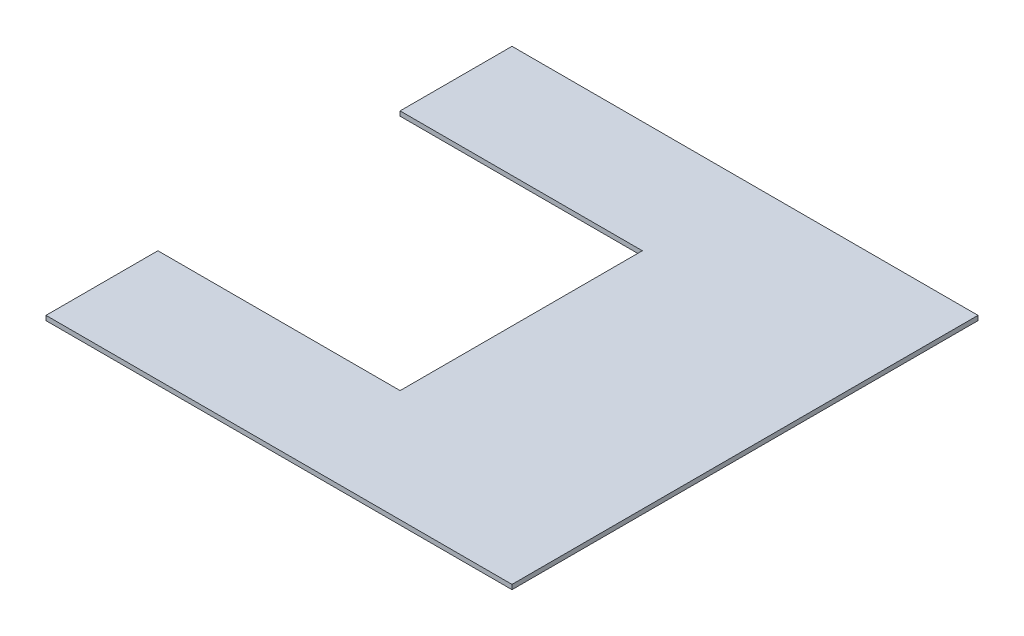
ISO-10303-21;
HEADER;
FILE_DESCRIPTION(('STEP AP214'),'2;1');
FILE_NAME('part.step','',(''),(''),'','','');
FILE_SCHEMA(('AUTOMOTIVE_DESIGN { 1 0 10303 214 1 1 1 1 }'));
ENDSEC;
DATA;
#1=APPLICATION_CONTEXT('core data for automotive mechanical design processes');
#2=APPLICATION_PROTOCOL_DEFINITION('international standard','automotive_design',2000,#1);
#3=PRODUCT_CONTEXT('',#1,'mechanical');
#4=PRODUCT('Part','Part','',(#3));
#5=PRODUCT_RELATED_PRODUCT_CATEGORY('part','',(#4));
#6=PRODUCT_DEFINITION_FORMATION('','',#4);
#7=PRODUCT_DEFINITION_CONTEXT('part definition',#1,'design');
#8=PRODUCT_DEFINITION('design','',#6,#7);
#9=PRODUCT_DEFINITION_SHAPE('','',#8);
#10=(LENGTH_UNIT() NAMED_UNIT(*) SI_UNIT(.MILLI.,.METRE.));
#11=(NAMED_UNIT(*) PLANE_ANGLE_UNIT() SI_UNIT($,.RADIAN.));
#12=(NAMED_UNIT(*) SI_UNIT($,.STERADIAN.) SOLID_ANGLE_UNIT());
#13=UNCERTAINTY_MEASURE_WITH_UNIT(LENGTH_MEASURE(1.E-05),#10,'distance_accuracy_value','');
#14=(GEOMETRIC_REPRESENTATION_CONTEXT(3) GLOBAL_UNCERTAINTY_ASSIGNED_CONTEXT((#13)) GLOBAL_UNIT_ASSIGNED_CONTEXT((#10,
#11,#12)) REPRESENTATION_CONTEXT('',''));
#15=CARTESIAN_POINT('',(0.,0.,0.));
#16=DIRECTION('',(0.,0.,1.));
#17=DIRECTION('',(1.,0.,0.));
#18=AXIS2_PLACEMENT_3D('',#15,#16,#17);
#19=CARTESIAN_POINT('',(-101.,2.,-101.));
#20=DIRECTION('',(1.,0.,0.));
#21=DIRECTION('',(0.,0.,-1.));
#22=AXIS2_PLACEMENT_3D('',#19,#20,#21);
#23=PLANE('',#22);
#24=DIRECTION('',(0.,0.,1.));
#25=VECTOR('',#24,1.);
#26=CARTESIAN_POINT('',(-101.,0.,-101.));
#27=LINE('',#26,#25);
#28=CARTESIAN_POINT('',(-101.,0.,-101.));
#29=VERTEX_POINT('',#28);
#30=CARTESIAN_POINT('',(-101.,0.,-52.5));
#31=VERTEX_POINT('',#30);
#32=EDGE_CURVE('E133',#29,#31,#27,.T.);
#33=ORIENTED_EDGE('',*,*,#32,.T.);
#34=DIRECTION('',(0.,-1.,0.));
#35=VECTOR('',#34,1.);
#36=CARTESIAN_POINT('',(-101.,2.001,-52.5));
#37=LINE('',#36,#35);
#38=CARTESIAN_POINT('',(-101.,2.,-52.5));
#39=VERTEX_POINT('',#38);
#40=EDGE_CURVE('E120',#39,#31,#37,.T.);
#41=ORIENTED_EDGE('',*,*,#40,.F.);
#42=DIRECTION('',(0.,0.,1.));
#43=VECTOR('',#42,1.);
#44=CARTESIAN_POINT('',(-101.,2.,-101.));
#45=LINE('',#44,#43);
#46=CARTESIAN_POINT('',(-101.,2.,-101.));
#47=VERTEX_POINT('',#46);
#48=EDGE_CURVE('E131',#47,#39,#45,.T.);
#49=ORIENTED_EDGE('',*,*,#48,.F.);
#50=DIRECTION('',(0.,-1.,0.));
#51=VECTOR('',#50,1.);
#52=CARTESIAN_POINT('',(-101.,2.,-101.));
#53=LINE('',#52,#51);
#54=EDGE_CURVE('E49',#47,#29,#53,.T.);
#55=ORIENTED_EDGE('',*,*,#54,.T.);
#56=EDGE_LOOP('',(#33,#41,#49,#55));
#57=FACE_BOUND('',#56,.T.);
#58=ADVANCED_FACE('F41',(#57),#23,.F.);
#59=CARTESIAN_POINT('',(101.,2.,-101.));
#60=DIRECTION('',(-1.,0.,0.));
#61=DIRECTION('',(0.,0.,1.));
#62=AXIS2_PLACEMENT_3D('',#59,#60,#61);
#63=PLANE('',#62);
#64=DIRECTION('',(0.,0.,-1.));
#65=VECTOR('',#64,1.);
#66=CARTESIAN_POINT('',(101.,0.,-101.));
#67=LINE('',#66,#65);
#68=CARTESIAN_POINT('',(101.,0.,101.));
#69=VERTEX_POINT('',#68);
#70=CARTESIAN_POINT('',(101.,0.,-101.));
#71=VERTEX_POINT('',#70);
#72=EDGE_CURVE('E144',#69,#71,#67,.T.);
#73=ORIENTED_EDGE('',*,*,#72,.T.);
#74=DIRECTION('',(0.,-1.,0.));
#75=VECTOR('',#74,1.);
#76=CARTESIAN_POINT('',(101.,2.,-101.));
#77=LINE('',#76,#75);
#78=CARTESIAN_POINT('',(101.,2.,-101.));
#79=VERTEX_POINT('',#78);
#80=EDGE_CURVE('E11',#79,#71,#77,.T.);
#81=ORIENTED_EDGE('',*,*,#80,.F.);
#82=DIRECTION('',(0.,0.,-1.));
#83=VECTOR('',#82,1.);
#84=CARTESIAN_POINT('',(101.,2.,-101.));
#85=LINE('',#84,#83);
#86=CARTESIAN_POINT('',(101.,2.,101.));
#87=VERTEX_POINT('',#86);
#88=EDGE_CURVE('E153',#87,#79,#85,.T.);
#89=ORIENTED_EDGE('',*,*,#88,.F.);
#90=DIRECTION('',(0.,-1.,0.));
#91=VECTOR('',#90,1.);
#92=CARTESIAN_POINT('',(101.,2.,101.));
#93=LINE('',#92,#91);
#94=EDGE_CURVE('E139',#87,#69,#93,.T.);
#95=ORIENTED_EDGE('',*,*,#94,.T.);
#96=EDGE_LOOP('',(#73,#81,#89,#95));
#97=FACE_BOUND('',#96,.T.);
#98=ADVANCED_FACE('F43',(#97),#63,.F.);
#99=CARTESIAN_POINT('',(-101.,2.,-101.));
#100=DIRECTION('',(0.,0.,1.));
#101=DIRECTION('',(1.,0.,0.));
#102=AXIS2_PLACEMENT_3D('',#99,#100,#101);
#103=PLANE('',#102);
#104=DIRECTION('',(-1.,0.,0.));
#105=VECTOR('',#104,1.);
#106=CARTESIAN_POINT('',(-101.,0.,-101.));
#107=LINE('',#106,#105);
#108=EDGE_CURVE('E147',#71,#29,#107,.T.);
#109=ORIENTED_EDGE('',*,*,#108,.T.);
#110=ORIENTED_EDGE('',*,*,#54,.F.);
#111=DIRECTION('',(-1.,0.,0.));
#112=VECTOR('',#111,1.);
#113=CARTESIAN_POINT('',(-101.,2.,-101.));
#114=LINE('',#113,#112);
#115=EDGE_CURVE('E93',#79,#47,#114,.T.);
#116=ORIENTED_EDGE('',*,*,#115,.F.);
#117=ORIENTED_EDGE('',*,*,#80,.T.);
#118=EDGE_LOOP('',(#109,#110,#116,#117));
#119=FACE_BOUND('',#118,.T.);
#120=ADVANCED_FACE('F175',(#119),#103,.F.);
#121=CARTESIAN_POINT('',(-101.,2.,52.5));
#122=VERTEX_POINT('',#121);
#123=CARTESIAN_POINT('',(-101.,2.,101.));
#124=VERTEX_POINT('',#123);
#125=EDGE_CURVE('E137',#122,#124,#45,.T.);
#126=ORIENTED_EDGE('',*,*,#125,.F.);
#127=DIRECTION('',(0.,-1.,0.));
#128=VECTOR('',#127,1.);
#129=CARTESIAN_POINT('',(-101.,2.001,52.5));
#130=LINE('',#129,#128);
#131=CARTESIAN_POINT('',(-101.,0.,52.5));
#132=VERTEX_POINT('',#131);
#133=EDGE_CURVE('E134',#122,#132,#130,.T.);
#134=ORIENTED_EDGE('',*,*,#133,.T.);
#135=CARTESIAN_POINT('',(-101.,0.,101.));
#136=VERTEX_POINT('',#135);
#137=EDGE_CURVE('E150',#132,#136,#27,.T.);
#138=ORIENTED_EDGE('',*,*,#137,.T.);
#139=DIRECTION('',(0.,-1.,0.));
#140=VECTOR('',#139,1.);
#141=CARTESIAN_POINT('',(-101.,2.,101.));
#142=LINE('',#141,#140);
#143=EDGE_CURVE('E155',#124,#136,#142,.T.);
#144=ORIENTED_EDGE('',*,*,#143,.F.);
#145=EDGE_LOOP('',(#126,#134,#138,#144));
#146=FACE_BOUND('',#145,.T.);
#147=ADVANCED_FACE('F177',(#146),#23,.F.);
#148=CARTESIAN_POINT('',(-101.,2.,101.));
#149=DIRECTION('',(0.,0.,-1.));
#150=DIRECTION('',(-1.,0.,0.));
#151=AXIS2_PLACEMENT_3D('',#148,#149,#150);
#152=PLANE('',#151);
#153=DIRECTION('',(1.,0.,0.));
#154=VECTOR('',#153,1.);
#155=CARTESIAN_POINT('',(-101.,0.,101.));
#156=LINE('',#155,#154);
#157=EDGE_CURVE('E86',#136,#69,#156,.T.);
#158=ORIENTED_EDGE('',*,*,#157,.T.);
#159=ORIENTED_EDGE('',*,*,#94,.F.);
#160=DIRECTION('',(1.,0.,0.));
#161=VECTOR('',#160,1.);
#162=CARTESIAN_POINT('',(-101.,2.,101.));
#163=LINE('',#162,#161);
#164=EDGE_CURVE('E65',#124,#87,#163,.T.);
#165=ORIENTED_EDGE('',*,*,#164,.F.);
#166=ORIENTED_EDGE('',*,*,#143,.T.);
#167=EDGE_LOOP('',(#158,#159,#165,#166));
#168=FACE_BOUND('',#167,.T.);
#169=ADVANCED_FACE('F182',(#168),#152,.F.);
#170=CARTESIAN_POINT('',(0.,2.,0.));
#171=DIRECTION('',(0.,1.,0.));
#172=DIRECTION('',(0.,0.,1.));
#173=AXIS2_PLACEMENT_3D('',#170,#171,#172);
#174=PLANE('',#173);
#175=DIRECTION('',(1.,0.,0.));
#176=VECTOR('',#175,1.);
#177=CARTESIAN_POINT('',(-101.,2.,-52.5));
#178=LINE('',#177,#176);
#179=CARTESIAN_POINT('',(4.,2.,-52.5));
#180=VERTEX_POINT('',#179);
#181=EDGE_CURVE('E116',#39,#180,#178,.T.);
#182=ORIENTED_EDGE('',*,*,#181,.T.);
#183=DIRECTION('',(0.,0.,1.));
#184=VECTOR('',#183,1.);
#185=CARTESIAN_POINT('',(4.,2.,52.5));
#186=LINE('',#185,#184);
#187=CARTESIAN_POINT('',(4.,2.,52.5));
#188=VERTEX_POINT('',#187);
#189=EDGE_CURVE('E125',#180,#188,#186,.T.);
#190=ORIENTED_EDGE('',*,*,#189,.T.);
#191=DIRECTION('',(-1.,0.,0.));
#192=VECTOR('',#191,1.);
#193=CARTESIAN_POINT('',(-101.,2.,52.5));
#194=LINE('',#193,#192);
#195=EDGE_CURVE('E148',#188,#122,#194,.T.);
#196=ORIENTED_EDGE('',*,*,#195,.T.);
#197=ORIENTED_EDGE('',*,*,#125,.T.);
#198=ORIENTED_EDGE('',*,*,#164,.T.);
#199=ORIENTED_EDGE('',*,*,#88,.T.);
#200=ORIENTED_EDGE('',*,*,#115,.T.);
#201=ORIENTED_EDGE('',*,*,#48,.T.);
#202=EDGE_LOOP('',(#182,#190,#196,#197,#198,#199,#200,#201));
#203=FACE_BOUND('',#202,.T.);
#204=ADVANCED_FACE('F136',(#203),#174,.T.);
#205=CARTESIAN_POINT('',(0.,0.,0.));
#206=DIRECTION('',(0.,1.,0.));
#207=DIRECTION('',(0.,0.,1.));
#208=AXIS2_PLACEMENT_3D('',#205,#206,#207);
#209=PLANE('',#208);
#210=DIRECTION('',(0.,0.,1.));
#211=VECTOR('',#210,1.);
#212=CARTESIAN_POINT('',(4.,0.,52.5));
#213=LINE('',#212,#211);
#214=CARTESIAN_POINT('',(4.,0.,-52.5));
#215=VERTEX_POINT('',#214);
#216=CARTESIAN_POINT('',(4.,0.,52.5));
#217=VERTEX_POINT('',#216);
#218=EDGE_CURVE('E56',#215,#217,#213,.T.);
#219=ORIENTED_EDGE('',*,*,#218,.F.);
#220=DIRECTION('',(1.,0.,0.));
#221=VECTOR('',#220,1.);
#222=CARTESIAN_POINT('',(-101.,0.,-52.5));
#223=LINE('',#222,#221);
#224=EDGE_CURVE('E159',#31,#215,#223,.T.);
#225=ORIENTED_EDGE('',*,*,#224,.F.);
#226=ORIENTED_EDGE('',*,*,#32,.F.);
#227=ORIENTED_EDGE('',*,*,#108,.F.);
#228=ORIENTED_EDGE('',*,*,#72,.F.);
#229=ORIENTED_EDGE('',*,*,#157,.F.);
#230=ORIENTED_EDGE('',*,*,#137,.F.);
#231=DIRECTION('',(-1.,0.,0.));
#232=VECTOR('',#231,1.);
#233=CARTESIAN_POINT('',(-101.,0.,52.5));
#234=LINE('',#233,#232);
#235=EDGE_CURVE('E162',#217,#132,#234,.T.);
#236=ORIENTED_EDGE('',*,*,#235,.F.);
#237=EDGE_LOOP('',(#219,#225,#226,#227,#228,#229,#230,#236));
#238=FACE_BOUND('',#237,.T.);
#239=ADVANCED_FACE('F157',(#238),#209,.F.);
#240=CARTESIAN_POINT('',(4.,2.001,52.5));
#241=DIRECTION('',(1.,0.,0.));
#242=DIRECTION('',(0.,0.,-1.));
#243=AXIS2_PLACEMENT_3D('',#240,#241,#242);
#244=PLANE('',#243);
#245=DIRECTION('',(0.,-1.,0.));
#246=VECTOR('',#245,1.);
#247=CARTESIAN_POINT('',(4.,2.001,-52.5));
#248=LINE('',#247,#246);
#249=EDGE_CURVE('E122',#180,#215,#248,.T.);
#250=ORIENTED_EDGE('',*,*,#249,.T.);
#251=ORIENTED_EDGE('',*,*,#218,.T.);
#252=DIRECTION('',(0.,-1.,0.));
#253=VECTOR('',#252,1.);
#254=CARTESIAN_POINT('',(4.,2.001,52.5));
#255=LINE('',#254,#253);
#256=EDGE_CURVE('E161',#188,#217,#255,.T.);
#257=ORIENTED_EDGE('',*,*,#256,.F.);
#258=ORIENTED_EDGE('',*,*,#189,.F.);
#259=EDGE_LOOP('',(#250,#251,#257,#258));
#260=FACE_BOUND('',#259,.T.);
#261=ADVANCED_FACE('F193',(#260),#244,.F.);
#262=CARTESIAN_POINT('',(-101.,2.001,-52.5));
#263=DIRECTION('',(0.,0.,-1.));
#264=DIRECTION('',(-1.,0.,0.));
#265=AXIS2_PLACEMENT_3D('',#262,#263,#264);
#266=PLANE('',#265);
#267=ORIENTED_EDGE('',*,*,#40,.T.);
#268=ORIENTED_EDGE('',*,*,#224,.T.);
#269=ORIENTED_EDGE('',*,*,#249,.F.);
#270=ORIENTED_EDGE('',*,*,#181,.F.);
#271=EDGE_LOOP('',(#267,#268,#269,#270));
#272=FACE_BOUND('',#271,.T.);
#273=ADVANCED_FACE('F118',(#272),#266,.F.);
#274=CARTESIAN_POINT('',(-101.,2.001,52.5));
#275=DIRECTION('',(0.,0.,1.));
#276=DIRECTION('',(1.,0.,0.));
#277=AXIS2_PLACEMENT_3D('',#274,#275,#276);
#278=PLANE('',#277);
#279=ORIENTED_EDGE('',*,*,#256,.T.);
#280=ORIENTED_EDGE('',*,*,#235,.T.);
#281=ORIENTED_EDGE('',*,*,#133,.F.);
#282=ORIENTED_EDGE('',*,*,#195,.F.);
#283=EDGE_LOOP('',(#279,#280,#281,#282));
#284=FACE_BOUND('',#283,.T.);
#285=ADVANCED_FACE('F198',(#284),#278,.F.);
#286=CLOSED_SHELL('',(#58,#98,#120,#147,#169,#204,#239,#261,#273,#285));
#287=MANIFOLD_SOLID_BREP('B2',#286);
#288=ADVANCED_BREP_SHAPE_REPRESENTATION('',(#18,#287),#14);
#289=SHAPE_DEFINITION_REPRESENTATION(#9,#288);
ENDSEC;
END-ISO-10303-21;
